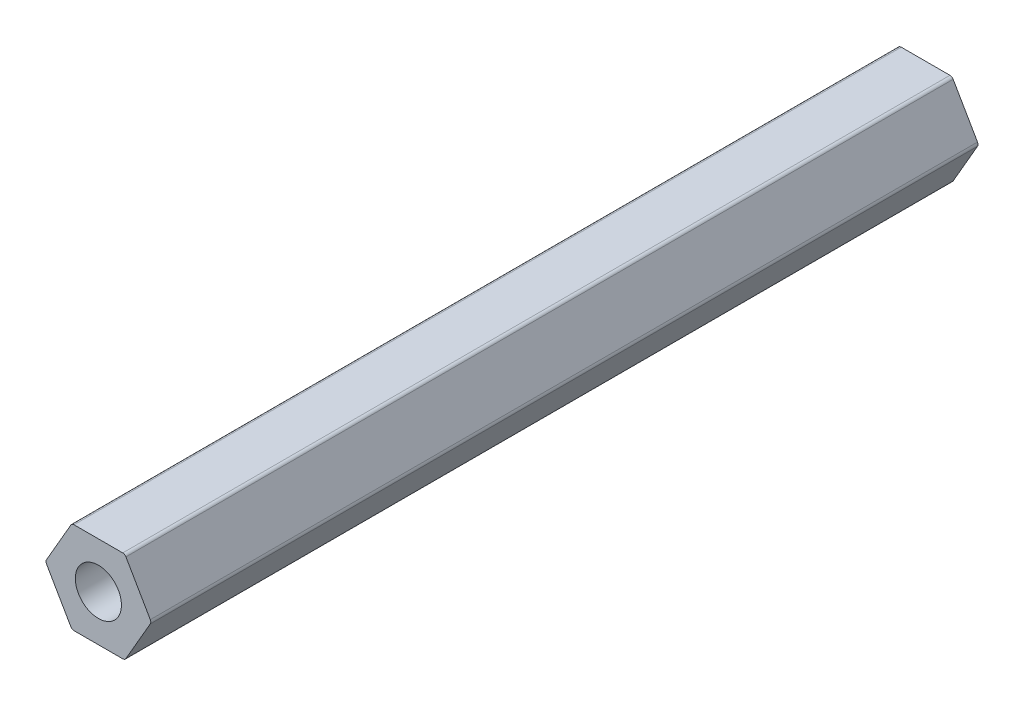
ISO-10303-21;
HEADER;
FILE_DESCRIPTION(('STEP AP214'),'2;1');
FILE_NAME('part.step','',(''),(''),'','','');
FILE_SCHEMA(('AUTOMOTIVE_DESIGN { 1 0 10303 214 1 1 1 1 }'));
ENDSEC;
DATA;
#1=APPLICATION_CONTEXT('core data for automotive mechanical design processes');
#2=APPLICATION_PROTOCOL_DEFINITION('international standard','automotive_design',2000,#1);
#3=PRODUCT_CONTEXT('',#1,'mechanical');
#4=PRODUCT('Part','Part','',(#3));
#5=PRODUCT_RELATED_PRODUCT_CATEGORY('part','',(#4));
#6=PRODUCT_DEFINITION_FORMATION('','',#4);
#7=PRODUCT_DEFINITION_CONTEXT('part definition',#1,'design');
#8=PRODUCT_DEFINITION('design','',#6,#7);
#9=PRODUCT_DEFINITION_SHAPE('','',#8);
#10=(LENGTH_UNIT() NAMED_UNIT(*) SI_UNIT(.MILLI.,.METRE.));
#11=(NAMED_UNIT(*) PLANE_ANGLE_UNIT() SI_UNIT($,.RADIAN.));
#12=(NAMED_UNIT(*) SI_UNIT($,.STERADIAN.) SOLID_ANGLE_UNIT());
#13=UNCERTAINTY_MEASURE_WITH_UNIT(LENGTH_MEASURE(1.E-05),#10,'distance_accuracy_value','');
#14=(GEOMETRIC_REPRESENTATION_CONTEXT(3) GLOBAL_UNCERTAINTY_ASSIGNED_CONTEXT((#13)) GLOBAL_UNIT_ASSIGNED_CONTEXT((#10,
#11,#12)) REPRESENTATION_CONTEXT('',''));
#15=CARTESIAN_POINT('',(0.,0.,0.));
#16=DIRECTION('',(0.,0.,1.));
#17=DIRECTION('',(1.,0.,0.));
#18=AXIS2_PLACEMENT_3D('',#15,#16,#17);
#19=CARTESIAN_POINT('',(-3.36554792418708,-5.8293,228.6));
#20=DIRECTION('',(0.,0.,-1.));
#21=DIRECTION('',(-1.,0.,0.));
#22=AXIS2_PLACEMENT_3D('',#19,#20,#21);
#23=CYLINDRICAL_SURFACE('',#22,0.508);
#24=DIRECTION('',(0.,0.,1.));
#25=VECTOR('',#24,1.);
#26=CARTESIAN_POINT('',(-3.36554792418708,-6.3373,228.6));
#27=LINE('',#26,#25);
#28=CARTESIAN_POINT('',(-3.36554792418708,-6.3373,-228.6));
#29=VERTEX_POINT('',#28);
#30=CARTESIAN_POINT('',(-3.36554792418708,-6.3373,-114.3));
#31=VERTEX_POINT('',#30);
#32=EDGE_CURVE('E150',#29,#31,#27,.T.);
#33=ORIENTED_EDGE('',*,*,#32,.T.);
#34=CARTESIAN_POINT('',(-3.36554792418708,-5.8293,-114.3));
#35=DIRECTION('',(0.,0.,1.));
#36=DIRECTION('',(1.,0.,0.));
#37=AXIS2_PLACEMENT_3D('',#34,#35,#36);
#38=CIRCLE('',#37,0.507999999999999);
#39=CARTESIAN_POINT('',(-3.80548882930957,-6.0833,-114.3));
#40=VERTEX_POINT('',#39);
#41=EDGE_CURVE('E200',#40,#31,#38,.T.);
#42=ORIENTED_EDGE('',*,*,#41,.F.);
#43=DIRECTION('',(0.,0.,1.));
#44=VECTOR('',#43,1.);
#45=CARTESIAN_POINT('',(-3.80548882930957,-6.0833,228.6));
#46=LINE('',#45,#44);
#47=CARTESIAN_POINT('',(-3.80548882930957,-6.0833,-228.6));
#48=VERTEX_POINT('',#47);
#49=EDGE_CURVE('E117',#40,#48,#46,.F.);
#50=ORIENTED_EDGE('',*,*,#49,.T.);
#51=CARTESIAN_POINT('',(-3.36554792418708,-5.8293,-228.6));
#52=DIRECTION('',(0.,0.,-1.));
#53=DIRECTION('',(-1.,0.,0.));
#54=AXIS2_PLACEMENT_3D('',#51,#52,#53);
#55=CIRCLE('',#54,0.508);
#56=EDGE_CURVE('E37',#48,#29,#55,.F.);
#57=ORIENTED_EDGE('',*,*,#56,.T.);
#58=EDGE_LOOP('',(#33,#42,#50,#57));
#59=FACE_BOUND('',#58,.T.);
#60=ADVANCED_FACE('F34',(#59),#23,.T.);
#61=CARTESIAN_POINT('',(3.36554792418708,5.8293,228.6));
#62=DIRECTION('',(0.,0.,-1.));
#63=DIRECTION('',(-1.,0.,0.));
#64=AXIS2_PLACEMENT_3D('',#61,#62,#63);
#65=CYLINDRICAL_SURFACE('',#64,0.508);
#66=DIRECTION('',(0.,0.,1.));
#67=VECTOR('',#66,1.);
#68=CARTESIAN_POINT('',(3.36554792418708,6.3373,228.6));
#69=LINE('',#68,#67);
#70=CARTESIAN_POINT('',(3.36554792418708,6.3373,-228.6));
#71=VERTEX_POINT('',#70);
#72=CARTESIAN_POINT('',(3.36554792418708,6.3373,-114.3));
#73=VERTEX_POINT('',#72);
#74=EDGE_CURVE('E144',#71,#73,#69,.T.);
#75=ORIENTED_EDGE('',*,*,#74,.T.);
#76=CARTESIAN_POINT('',(3.36554792418708,5.8293,-114.3));
#77=DIRECTION('',(0.,0.,1.));
#78=DIRECTION('',(1.,0.,0.));
#79=AXIS2_PLACEMENT_3D('',#76,#77,#78);
#80=CIRCLE('',#79,0.508000000000001);
#81=CARTESIAN_POINT('',(3.80548882930958,6.0833,-114.3));
#82=VERTEX_POINT('',#81);
#83=EDGE_CURVE('E234',#82,#73,#80,.T.);
#84=ORIENTED_EDGE('',*,*,#83,.F.);
#85=DIRECTION('',(0.,0.,1.));
#86=VECTOR('',#85,1.);
#87=CARTESIAN_POINT('',(3.80548882930958,6.0833,228.6));
#88=LINE('',#87,#86);
#89=CARTESIAN_POINT('',(3.80548882930958,6.0833,-228.6));
#90=VERTEX_POINT('',#89);
#91=EDGE_CURVE('E147',#82,#90,#88,.F.);
#92=ORIENTED_EDGE('',*,*,#91,.T.);
#93=CARTESIAN_POINT('',(3.36554792418708,5.8293,-228.6));
#94=DIRECTION('',(0.,0.,-1.));
#95=DIRECTION('',(-1.,0.,0.));
#96=AXIS2_PLACEMENT_3D('',#93,#94,#95);
#97=CIRCLE('',#96,0.508);
#98=EDGE_CURVE('E161',#90,#71,#97,.F.);
#99=ORIENTED_EDGE('',*,*,#98,.T.);
#100=EDGE_LOOP('',(#75,#84,#92,#99));
#101=FACE_BOUND('',#100,.T.);
#102=ADVANCED_FACE('F233',(#101),#65,.T.);
#103=CARTESIAN_POINT('',(-3.36554792418708,5.8293,228.6));
#104=DIRECTION('',(0.,0.,-1.));
#105=DIRECTION('',(-1.,0.,0.));
#106=AXIS2_PLACEMENT_3D('',#103,#104,#105);
#107=CYLINDRICAL_SURFACE('',#106,0.508);
#108=DIRECTION('',(0.,0.,1.));
#109=VECTOR('',#108,1.);
#110=CARTESIAN_POINT('',(-3.80548882930958,6.0833,228.6));
#111=LINE('',#110,#109);
#112=CARTESIAN_POINT('',(-3.80548882930958,6.0833,-228.6));
#113=VERTEX_POINT('',#112);
#114=CARTESIAN_POINT('',(-3.80548882930958,6.0833,-114.3));
#115=VERTEX_POINT('',#114);
#116=EDGE_CURVE('E138',#113,#115,#111,.T.);
#117=ORIENTED_EDGE('',*,*,#116,.T.);
#118=CARTESIAN_POINT('',(-3.36554792418708,5.8293,-114.3));
#119=DIRECTION('',(0.,0.,1.));
#120=DIRECTION('',(1.,0.,0.));
#121=AXIS2_PLACEMENT_3D('',#118,#119,#120);
#122=CIRCLE('',#121,0.508);
#123=CARTESIAN_POINT('',(-3.36554792418708,6.3373,-114.3));
#124=VERTEX_POINT('',#123);
#125=EDGE_CURVE('E169',#124,#115,#122,.T.);
#126=ORIENTED_EDGE('',*,*,#125,.F.);
#127=DIRECTION('',(0.,0.,1.));
#128=VECTOR('',#127,1.);
#129=CARTESIAN_POINT('',(-3.36554792418708,6.3373,228.6));
#130=LINE('',#129,#128);
#131=CARTESIAN_POINT('',(-3.36554792418708,6.3373,-228.6));
#132=VERTEX_POINT('',#131);
#133=EDGE_CURVE('E141',#124,#132,#130,.F.);
#134=ORIENTED_EDGE('',*,*,#133,.T.);
#135=CARTESIAN_POINT('',(-3.36554792418708,5.8293,-228.6));
#136=DIRECTION('',(0.,0.,-1.));
#137=DIRECTION('',(-1.,0.,0.));
#138=AXIS2_PLACEMENT_3D('',#135,#136,#137);
#139=CIRCLE('',#138,0.508);
#140=EDGE_CURVE('E107',#132,#113,#139,.F.);
#141=ORIENTED_EDGE('',*,*,#140,.T.);
#142=EDGE_LOOP('',(#117,#126,#134,#141));
#143=FACE_BOUND('',#142,.T.);
#144=ADVANCED_FACE('F227',(#143),#107,.T.);
#145=CARTESIAN_POINT('',(-6.73109584837417,0.,228.6));
#146=DIRECTION('',(0.,0.,-1.));
#147=DIRECTION('',(-1.,0.,0.));
#148=AXIS2_PLACEMENT_3D('',#145,#146,#147);
#149=CYLINDRICAL_SURFACE('',#148,0.508);
#150=DIRECTION('',(0.,0.,1.));
#151=VECTOR('',#150,1.);
#152=CARTESIAN_POINT('',(-7.17103675349666,-0.254000000000004,228.6));
#153=LINE('',#152,#151);
#154=CARTESIAN_POINT('',(-7.17103675349666,-0.254000000000004,-228.6));
#155=VERTEX_POINT('',#154);
#156=CARTESIAN_POINT('',(-7.17103675349666,-0.254000000000005,-114.3));
#157=VERTEX_POINT('',#156);
#158=EDGE_CURVE('E100',#155,#157,#153,.T.);
#159=ORIENTED_EDGE('',*,*,#158,.T.);
#160=CARTESIAN_POINT('',(-6.73109584837417,0.,-114.3));
#161=DIRECTION('',(0.,0.,1.));
#162=DIRECTION('',(1.,0.,0.));
#163=AXIS2_PLACEMENT_3D('',#160,#161,#162);
#164=CIRCLE('',#163,0.508000000000001);
#165=CARTESIAN_POINT('',(-7.17103675349666,0.253999999999996,-114.3));
#166=VERTEX_POINT('',#165);
#167=EDGE_CURVE('E252',#166,#157,#164,.T.);
#168=ORIENTED_EDGE('',*,*,#167,.F.);
#169=DIRECTION('',(0.,0.,1.));
#170=VECTOR('',#169,1.);
#171=CARTESIAN_POINT('',(-7.17103675349666,0.253999999999996,228.6));
#172=LINE('',#171,#170);
#173=CARTESIAN_POINT('',(-7.17103675349666,0.253999999999996,-228.6));
#174=VERTEX_POINT('',#173);
#175=EDGE_CURVE('E102',#166,#174,#172,.F.);
#176=ORIENTED_EDGE('',*,*,#175,.T.);
#177=CARTESIAN_POINT('',(-6.73109584837417,0.,-228.6));
#178=DIRECTION('',(0.,0.,-1.));
#179=DIRECTION('',(-1.,0.,0.));
#180=AXIS2_PLACEMENT_3D('',#177,#178,#179);
#181=CIRCLE('',#180,0.508);
#182=EDGE_CURVE('E95',#174,#155,#181,.F.);
#183=ORIENTED_EDGE('',*,*,#182,.T.);
#184=EDGE_LOOP('',(#159,#168,#176,#183));
#185=FACE_BOUND('',#184,.T.);
#186=ADVANCED_FACE('F97',(#185),#149,.T.);
#187=CARTESIAN_POINT('',(-7.31768372187083,0.,228.6));
#188=DIRECTION('',(0.866025403784438,0.5,0.));
#189=DIRECTION('',(-0.5,0.866025403784438,0.));
#190=AXIS2_PLACEMENT_3D('',#187,#188,#189);
#191=PLANE('',#190);
#192=DIRECTION('',(0.500000000000001,-0.866025403784438,0.));
#193=VECTOR('',#192,1.);
#194=CARTESIAN_POINT('',(-7.17103675349666,-0.254000000000005,-114.3));
#195=LINE('',#194,#193);
#196=EDGE_CURVE('E116',#157,#40,#195,.T.);
#197=ORIENTED_EDGE('',*,*,#196,.F.);
#198=ORIENTED_EDGE('',*,*,#158,.F.);
#199=DIRECTION('',(0.500000000000001,-0.866025403784438,0.));
#200=VECTOR('',#199,1.);
#201=CARTESIAN_POINT('',(-7.17103675349666,-0.254000000000004,-228.6));
#202=LINE('',#201,#200);
#203=EDGE_CURVE('E114',#155,#48,#202,.T.);
#204=ORIENTED_EDGE('',*,*,#203,.T.);
#205=ORIENTED_EDGE('',*,*,#49,.F.);
#206=EDGE_LOOP('',(#197,#198,#204,#205));
#207=FACE_BOUND('',#206,.T.);
#208=ADVANCED_FACE('F112',(#207),#191,.F.);
#209=CARTESIAN_POINT('',(-3.65884186093541,-6.3373,228.6));
#210=DIRECTION('',(0.,1.,0.));
#211=DIRECTION('',(-1.,0.,0.));
#212=AXIS2_PLACEMENT_3D('',#209,#210,#211);
#213=PLANE('',#212);
#214=DIRECTION('',(1.,0.,0.));
#215=VECTOR('',#214,1.);
#216=CARTESIAN_POINT('',(-3.36554792418708,-6.3373,-114.3));
#217=LINE('',#216,#215);
#218=CARTESIAN_POINT('',(3.36554792418708,-6.3373,-114.3));
#219=VERTEX_POINT('',#218);
#220=EDGE_CURVE('E192',#31,#219,#217,.T.);
#221=ORIENTED_EDGE('',*,*,#220,.F.);
#222=ORIENTED_EDGE('',*,*,#32,.F.);
#223=DIRECTION('',(1.,0.,0.));
#224=VECTOR('',#223,1.);
#225=CARTESIAN_POINT('',(7.31768372187083,-6.3373,-228.6));
#226=LINE('',#225,#224);
#227=CARTESIAN_POINT('',(3.36554792418708,-6.3373,-228.6));
#228=VERTEX_POINT('',#227);
#229=EDGE_CURVE('E122',#29,#228,#226,.T.);
#230=ORIENTED_EDGE('',*,*,#229,.T.);
#231=DIRECTION('',(0.,0.,-1.));
#232=VECTOR('',#231,1.);
#233=CARTESIAN_POINT('',(3.36554792418708,-6.3373,228.6));
#234=LINE('',#233,#232);
#235=EDGE_CURVE('E126',#219,#228,#234,.T.);
#236=ORIENTED_EDGE('',*,*,#235,.F.);
#237=EDGE_LOOP('',(#221,#222,#230,#236));
#238=FACE_BOUND('',#237,.T.);
#239=ADVANCED_FACE('F196',(#238),#213,.F.);
#240=CARTESIAN_POINT('',(7.31768372187083,0.,228.6));
#241=DIRECTION('',(-0.866025403784439,-0.5,0.));
#242=DIRECTION('',(0.5,-0.866025403784439,0.));
#243=AXIS2_PLACEMENT_3D('',#240,#241,#242);
#244=PLANE('',#243);
#245=DIRECTION('',(-0.5,0.866025403784439,0.));
#246=VECTOR('',#245,1.);
#247=CARTESIAN_POINT('',(7.17103675349666,0.254000000000003,-114.3));
#248=LINE('',#247,#246);
#249=CARTESIAN_POINT('',(7.17103675349666,0.254000000000003,-114.3));
#250=VERTEX_POINT('',#249);
#251=EDGE_CURVE('E236',#250,#82,#248,.T.);
#252=ORIENTED_EDGE('',*,*,#251,.F.);
#253=DIRECTION('',(0.,0.,-1.));
#254=VECTOR('',#253,1.);
#255=CARTESIAN_POINT('',(7.17103675349666,0.254000000000004,228.6));
#256=LINE('',#255,#254);
#257=CARTESIAN_POINT('',(7.17103675349666,0.254000000000003,-228.6));
#258=VERTEX_POINT('',#257);
#259=EDGE_CURVE('E143',#258,#250,#256,.F.);
#260=ORIENTED_EDGE('',*,*,#259,.F.);
#261=DIRECTION('',(-0.5,0.866025403784438,0.));
#262=VECTOR('',#261,1.);
#263=CARTESIAN_POINT('',(7.17103675349666,0.254000000000003,-228.6));
#264=LINE('',#263,#262);
#265=EDGE_CURVE('E134',#258,#90,#264,.T.);
#266=ORIENTED_EDGE('',*,*,#265,.T.);
#267=ORIENTED_EDGE('',*,*,#91,.F.);
#268=EDGE_LOOP('',(#252,#260,#266,#267));
#269=FACE_BOUND('',#268,.T.);
#270=ADVANCED_FACE('F240',(#269),#244,.F.);
#271=CARTESIAN_POINT('',(3.65884186093541,6.3373,228.6));
#272=DIRECTION('',(0.,-1.,0.));
#273=DIRECTION('',(1.,0.,0.));
#274=AXIS2_PLACEMENT_3D('',#271,#272,#273);
#275=PLANE('',#274);
#276=DIRECTION('',(-1.,0.,0.));
#277=VECTOR('',#276,1.);
#278=CARTESIAN_POINT('',(3.36554792418708,6.3373,-114.3));
#279=LINE('',#278,#277);
#280=EDGE_CURVE('E174',#73,#124,#279,.T.);
#281=ORIENTED_EDGE('',*,*,#280,.F.);
#282=ORIENTED_EDGE('',*,*,#74,.F.);
#283=DIRECTION('',(1.,0.,0.));
#284=VECTOR('',#283,1.);
#285=CARTESIAN_POINT('',(7.31768372187083,6.3373,-228.6));
#286=LINE('',#285,#284);
#287=EDGE_CURVE('E128',#71,#132,#286,.F.);
#288=ORIENTED_EDGE('',*,*,#287,.T.);
#289=ORIENTED_EDGE('',*,*,#133,.F.);
#290=EDGE_LOOP('',(#281,#282,#288,#289));
#291=FACE_BOUND('',#290,.T.);
#292=ADVANCED_FACE('F231',(#291),#275,.F.);
#293=CARTESIAN_POINT('',(-3.65884186093541,6.3373,228.6));
#294=DIRECTION('',(0.866025403784439,-0.5,0.));
#295=DIRECTION('',(0.5,0.866025403784439,0.));
#296=AXIS2_PLACEMENT_3D('',#293,#294,#295);
#297=PLANE('',#296);
#298=DIRECTION('',(-0.5,-0.866025403784439,0.));
#299=VECTOR('',#298,1.);
#300=CARTESIAN_POINT('',(-3.80548882930958,6.0833,-114.3));
#301=LINE('',#300,#299);
#302=EDGE_CURVE('E165',#115,#166,#301,.T.);
#303=ORIENTED_EDGE('',*,*,#302,.F.);
#304=ORIENTED_EDGE('',*,*,#116,.F.);
#305=DIRECTION('',(-0.5,-0.866025403784439,0.));
#306=VECTOR('',#305,1.);
#307=CARTESIAN_POINT('',(-3.80548882930958,6.0833,-228.6));
#308=LINE('',#307,#306);
#309=EDGE_CURVE('E123',#113,#174,#308,.T.);
#310=ORIENTED_EDGE('',*,*,#309,.T.);
#311=ORIENTED_EDGE('',*,*,#175,.F.);
#312=EDGE_LOOP('',(#303,#304,#310,#311));
#313=FACE_BOUND('',#312,.T.);
#314=ADVANCED_FACE('F226',(#313),#297,.F.);
#315=CARTESIAN_POINT('',(6.73109584837417,0.,228.6));
#316=DIRECTION('',(0.,0.,-1.));
#317=DIRECTION('',(-1.,0.,0.));
#318=AXIS2_PLACEMENT_3D('',#315,#316,#317);
#319=CYLINDRICAL_SURFACE('',#318,0.508);
#320=ORIENTED_EDGE('',*,*,#259,.T.);
#321=CARTESIAN_POINT('',(6.73109584837417,0.,-114.3));
#322=DIRECTION('',(0.,0.,1.));
#323=DIRECTION('',(1.,0.,0.));
#324=AXIS2_PLACEMENT_3D('',#321,#322,#323);
#325=CIRCLE('',#324,0.508);
#326=CARTESIAN_POINT('',(7.17103675349667,-0.253999999999996,-114.3));
#327=VERTEX_POINT('',#326);
#328=EDGE_CURVE('E244',#327,#250,#325,.T.);
#329=ORIENTED_EDGE('',*,*,#328,.F.);
#330=DIRECTION('',(0.,0.,1.));
#331=VECTOR('',#330,1.);
#332=CARTESIAN_POINT('',(7.17103675349666,-0.253999999999996,228.6));
#333=LINE('',#332,#331);
#334=CARTESIAN_POINT('',(7.17103675349666,-0.253999999999997,-228.6));
#335=VERTEX_POINT('',#334);
#336=EDGE_CURVE('E158',#327,#335,#333,.F.);
#337=ORIENTED_EDGE('',*,*,#336,.T.);
#338=CARTESIAN_POINT('',(6.73109584837417,0.,-228.6));
#339=DIRECTION('',(0.,0.,-1.));
#340=DIRECTION('',(-1.,0.,0.));
#341=AXIS2_PLACEMENT_3D('',#338,#339,#340);
#342=CIRCLE('',#341,0.508);
#343=EDGE_CURVE('E137',#335,#258,#342,.F.);
#344=ORIENTED_EDGE('',*,*,#343,.T.);
#345=EDGE_LOOP('',(#320,#329,#337,#344));
#346=FACE_BOUND('',#345,.T.);
#347=ADVANCED_FACE('F242',(#346),#319,.T.);
#348=CARTESIAN_POINT('',(3.36554792418709,-5.8293,228.6));
#349=DIRECTION('',(0.,0.,-1.));
#350=DIRECTION('',(-1.,0.,0.));
#351=AXIS2_PLACEMENT_3D('',#348,#349,#350);
#352=CYLINDRICAL_SURFACE('',#351,0.508);
#353=DIRECTION('',(0.,0.,1.));
#354=VECTOR('',#353,1.);
#355=CARTESIAN_POINT('',(3.80548882930958,-6.0833,228.6));
#356=LINE('',#355,#354);
#357=CARTESIAN_POINT('',(3.80548882930958,-6.0833,-228.6));
#358=VERTEX_POINT('',#357);
#359=CARTESIAN_POINT('',(3.80548882930958,-6.0833,-114.3));
#360=VERTEX_POINT('',#359);
#361=EDGE_CURVE('E11',#358,#360,#356,.T.);
#362=ORIENTED_EDGE('',*,*,#361,.T.);
#363=CARTESIAN_POINT('',(3.36554792418709,-5.8293,-114.3));
#364=DIRECTION('',(0.,0.,1.));
#365=DIRECTION('',(1.,0.,0.));
#366=AXIS2_PLACEMENT_3D('',#363,#364,#365);
#367=CIRCLE('',#366,0.508000000000001);
#368=EDGE_CURVE('E50',#219,#360,#367,.T.);
#369=ORIENTED_EDGE('',*,*,#368,.F.);
#370=ORIENTED_EDGE('',*,*,#235,.T.);
#371=CARTESIAN_POINT('',(3.36554792418709,-5.8293,-228.6));
#372=DIRECTION('',(0.,0.,-1.));
#373=DIRECTION('',(-1.,0.,0.));
#374=AXIS2_PLACEMENT_3D('',#371,#372,#373);
#375=CIRCLE('',#374,0.508);
#376=EDGE_CURVE('E58',#228,#358,#375,.F.);
#377=ORIENTED_EDGE('',*,*,#376,.T.);
#378=EDGE_LOOP('',(#362,#369,#370,#377));
#379=FACE_BOUND('',#378,.T.);
#380=ADVANCED_FACE('F187',(#379),#352,.T.);
#381=CARTESIAN_POINT('',(3.65884186093542,-6.3373,228.6));
#382=DIRECTION('',(-0.866025403784439,0.5,0.));
#383=DIRECTION('',(-0.5,-0.866025403784439,0.));
#384=AXIS2_PLACEMENT_3D('',#381,#382,#383);
#385=PLANE('',#384);
#386=DIRECTION('',(0.499999999999999,0.866025403784439,0.));
#387=VECTOR('',#386,1.);
#388=CARTESIAN_POINT('',(3.80548882930958,-6.0833,-114.3));
#389=LINE('',#388,#387);
#390=EDGE_CURVE('E186',#360,#327,#389,.T.);
#391=ORIENTED_EDGE('',*,*,#390,.F.);
#392=ORIENTED_EDGE('',*,*,#361,.F.);
#393=DIRECTION('',(-0.5,-0.866025403784439,0.));
#394=VECTOR('',#393,1.);
#395=CARTESIAN_POINT('',(3.65884186093542,-6.3373,-228.6));
#396=LINE('',#395,#394);
#397=EDGE_CURVE('E42',#335,#358,#396,.T.);
#398=ORIENTED_EDGE('',*,*,#397,.F.);
#399=ORIENTED_EDGE('',*,*,#336,.F.);
#400=EDGE_LOOP('',(#391,#392,#398,#399));
#401=FACE_BOUND('',#400,.T.);
#402=ADVANCED_FACE('F184',(#401),#385,.F.);
#403=CARTESIAN_POINT('',(7.31768372187083,0.,-228.6));
#404=DIRECTION('',(0.,0.,1.));
#405=DIRECTION('',(1.,0.,0.));
#406=AXIS2_PLACEMENT_3D('',#403,#404,#405);
#407=PLANE('',#406);
#408=CARTESIAN_POINT('',(0.,0.,-228.6));
#409=DIRECTION('',(0.,0.,-1.));
#410=DIRECTION('',(-1.,0.,0.));
#411=AXIS2_PLACEMENT_3D('',#408,#409,#410);
#412=CIRCLE('',#411,3.1877);
#413=CARTESIAN_POINT('',(-3.1877,0.,-228.6));
#414=VERTEX_POINT('',#413);
#415=EDGE_CURVE('E255',#414,#414,#412,.T.);
#416=ORIENTED_EDGE('',*,*,#415,.F.);
#417=EDGE_LOOP('',(#416));
#418=FACE_BOUND('',#417,.T.);
#419=ORIENTED_EDGE('',*,*,#56,.F.);
#420=ORIENTED_EDGE('',*,*,#203,.F.);
#421=ORIENTED_EDGE('',*,*,#182,.F.);
#422=ORIENTED_EDGE('',*,*,#309,.F.);
#423=ORIENTED_EDGE('',*,*,#140,.F.);
#424=ORIENTED_EDGE('',*,*,#287,.F.);
#425=ORIENTED_EDGE('',*,*,#98,.F.);
#426=ORIENTED_EDGE('',*,*,#265,.F.);
#427=ORIENTED_EDGE('',*,*,#343,.F.);
#428=ORIENTED_EDGE('',*,*,#397,.T.);
#429=ORIENTED_EDGE('',*,*,#376,.F.);
#430=ORIENTED_EDGE('',*,*,#229,.F.);
#431=EDGE_LOOP('',(#419,#420,#421,#422,#423,#424,#425,#426,#427,#428,#429,#430));
#432=FACE_BOUND('',#431,.T.);
#433=ADVANCED_FACE('F120',(#418,#432),#407,.F.);
#434=CARTESIAN_POINT('',(-6.73109584837417,0.,-114.3));
#435=DIRECTION('',(0.,0.,1.));
#436=DIRECTION('',(1.,0.,0.));
#437=AXIS2_PLACEMENT_3D('',#434,#435,#436);
#438=PLANE('',#437);
#439=CARTESIAN_POINT('',(0.,0.,-114.3));
#440=DIRECTION('',(0.,0.,-1.));
#441=DIRECTION('',(-1.,0.,0.));
#442=AXIS2_PLACEMENT_3D('',#439,#440,#441);
#443=CIRCLE('',#442,3.1877);
#444=CARTESIAN_POINT('',(-3.1877,0.,-114.3));
#445=VERTEX_POINT('',#444);
#446=EDGE_CURVE('E254',#445,#445,#443,.T.);
#447=ORIENTED_EDGE('',*,*,#446,.T.);
#448=EDGE_LOOP('',(#447));
#449=FACE_BOUND('',#448,.T.);
#450=ORIENTED_EDGE('',*,*,#167,.T.);
#451=ORIENTED_EDGE('',*,*,#196,.T.);
#452=ORIENTED_EDGE('',*,*,#41,.T.);
#453=ORIENTED_EDGE('',*,*,#220,.T.);
#454=ORIENTED_EDGE('',*,*,#368,.T.);
#455=ORIENTED_EDGE('',*,*,#390,.T.);
#456=ORIENTED_EDGE('',*,*,#328,.T.);
#457=ORIENTED_EDGE('',*,*,#251,.T.);
#458=ORIENTED_EDGE('',*,*,#83,.T.);
#459=ORIENTED_EDGE('',*,*,#280,.T.);
#460=ORIENTED_EDGE('',*,*,#125,.T.);
#461=ORIENTED_EDGE('',*,*,#302,.T.);
#462=EDGE_LOOP('',(#450,#451,#452,#453,#454,#455,#456,#457,#458,#459,#460,#461));
#463=FACE_BOUND('',#462,.T.);
#464=ADVANCED_FACE('F220',(#449,#463),#438,.T.);
#465=CARTESIAN_POINT('',(0.,0.,-114.3));
#466=DIRECTION('',(0.,0.,-1.));
#467=DIRECTION('',(-1.,0.,0.));
#468=AXIS2_PLACEMENT_3D('',#465,#466,#467);
#469=CYLINDRICAL_SURFACE('',#468,3.1877);
#470=CARTESIAN_POINT('',(-3.1877,0.,-114.3));
#471=CARTESIAN_POINT('',(-3.1877,0.,-115.490625));
#472=CARTESIAN_POINT('',(-3.1877,0.,-116.68125));
#473=CARTESIAN_POINT('',(-3.1877,0.,-119.0625));
#474=CARTESIAN_POINT('',(-3.1877,0.,-120.253125));
#475=CARTESIAN_POINT('',(-3.1877,0.,-122.634375));
#476=CARTESIAN_POINT('',(-3.1877,0.,-123.825));
#477=CARTESIAN_POINT('',(-3.1877,0.,-126.20625));
#478=CARTESIAN_POINT('',(-3.1877,0.,-127.396875));
#479=CARTESIAN_POINT('',(-3.1877,0.,-129.778125));
#480=CARTESIAN_POINT('',(-3.1877,0.,-130.96875));
#481=CARTESIAN_POINT('',(-3.1877,0.,-133.35));
#482=CARTESIAN_POINT('',(-3.1877,0.,-134.540625));
#483=CARTESIAN_POINT('',(-3.1877,0.,-136.921875));
#484=CARTESIAN_POINT('',(-3.1877,0.,-138.1125));
#485=CARTESIAN_POINT('',(-3.1877,0.,-140.49375));
#486=CARTESIAN_POINT('',(-3.1877,0.,-141.684375));
#487=CARTESIAN_POINT('',(-3.1877,0.,-144.065625));
#488=CARTESIAN_POINT('',(-3.1877,0.,-145.25625));
#489=CARTESIAN_POINT('',(-3.1877,0.,-147.6375));
#490=CARTESIAN_POINT('',(-3.1877,0.,-148.828125));
#491=CARTESIAN_POINT('',(-3.1877,0.,-151.209375));
#492=CARTESIAN_POINT('',(-3.1877,0.,-152.4));
#493=CARTESIAN_POINT('',(-3.1877,0.,-154.78125));
#494=CARTESIAN_POINT('',(-3.1877,0.,-155.971875));
#495=CARTESIAN_POINT('',(-3.1877,0.,-158.353125));
#496=CARTESIAN_POINT('',(-3.1877,0.,-159.54375));
#497=CARTESIAN_POINT('',(-3.1877,0.,-161.925));
#498=CARTESIAN_POINT('',(-3.1877,0.,-163.115625));
#499=CARTESIAN_POINT('',(-3.1877,0.,-165.496875));
#500=CARTESIAN_POINT('',(-3.1877,0.,-166.6875));
#501=CARTESIAN_POINT('',(-3.1877,0.,-169.06875));
#502=CARTESIAN_POINT('',(-3.1877,0.,-170.259375));
#503=CARTESIAN_POINT('',(-3.1877,0.,-172.640625));
#504=CARTESIAN_POINT('',(-3.1877,0.,-173.83125));
#505=CARTESIAN_POINT('',(-3.1877,0.,-176.2125));
#506=CARTESIAN_POINT('',(-3.1877,0.,-177.403125));
#507=CARTESIAN_POINT('',(-3.1877,0.,-179.784375));
#508=CARTESIAN_POINT('',(-3.1877,0.,-180.975));
#509=CARTESIAN_POINT('',(-3.1877,0.,-183.35625));
#510=CARTESIAN_POINT('',(-3.1877,0.,-184.546875));
#511=CARTESIAN_POINT('',(-3.1877,0.,-186.928125));
#512=CARTESIAN_POINT('',(-3.1877,0.,-188.11875));
#513=CARTESIAN_POINT('',(-3.1877,0.,-190.5));
#514=CARTESIAN_POINT('',(-3.1877,0.,-191.690625));
#515=CARTESIAN_POINT('',(-3.1877,0.,-194.071875));
#516=CARTESIAN_POINT('',(-3.1877,0.,-195.2625));
#517=CARTESIAN_POINT('',(-3.1877,0.,-197.64375));
#518=CARTESIAN_POINT('',(-3.1877,0.,-198.834375));
#519=CARTESIAN_POINT('',(-3.1877,0.,-201.215625));
#520=CARTESIAN_POINT('',(-3.1877,0.,-202.40625));
#521=CARTESIAN_POINT('',(-3.1877,0.,-204.7875));
#522=CARTESIAN_POINT('',(-3.1877,0.,-205.978125));
#523=CARTESIAN_POINT('',(-3.1877,0.,-208.359375));
#524=CARTESIAN_POINT('',(-3.1877,0.,-209.55));
#525=CARTESIAN_POINT('',(-3.1877,0.,-211.93125));
#526=CARTESIAN_POINT('',(-3.1877,0.,-213.121875));
#527=CARTESIAN_POINT('',(-3.1877,0.,-215.503125));
#528=CARTESIAN_POINT('',(-3.1877,0.,-216.69375));
#529=CARTESIAN_POINT('',(-3.1877,0.,-219.075));
#530=CARTESIAN_POINT('',(-3.1877,0.,-220.265625));
#531=CARTESIAN_POINT('',(-3.1877,0.,-222.646875));
#532=CARTESIAN_POINT('',(-3.1877,0.,-223.8375));
#533=CARTESIAN_POINT('',(-3.1877,0.,-226.21875));
#534=CARTESIAN_POINT('',(-3.1877,0.,-227.409375));
#535=CARTESIAN_POINT('',(-3.1877,0.,-228.6));
#536=B_SPLINE_CURVE_WITH_KNOTS('',3,(#470,#471,#472,#473,#474,#475,#476,#477,#478,#479,#480,
#481,#482,#483,#484,#485,#486,#487,#488,#489,#490,#491,#492,#493,#494,#495,#496,#497,#498,#499,
#500,#501,#502,#503,#504,#505,#506,#507,#508,#509,#510,#511,#512,#513,#514,#515,#516,#517,#518,
#519,#520,#521,#522,#523,#524,#525,#526,#527,#528,#529,#530,#531,#532,#533,#534,#535),
.UNSPECIFIED.,.F.,.F.,(4,2,2,2,2,2,2,2,2,2,2,2,2,2,2,2,2,2,2,2,2,2,2,2,2,2,2,2,2,2,2,2,4),(0.,
3.57187499999999,7.14374999999999,10.715625,14.2875,17.859375,21.43125,25.003125,28.575,
32.146875,35.71875,39.290625,42.8625,46.434375,50.00625,53.578125,57.15,60.721875,64.29375,
67.865625,71.4375,75.009375,78.58125,82.153125,85.725,89.296875,92.86875,96.440625,100.0125,
103.584375,107.15625,110.728125,114.3),.UNSPECIFIED.);
#537=EDGE_CURVE('BSEAM262',#445,#414,#536,.T.);
#538=ORIENTED_EDGE('',*,*,#446,.F.);
#539=ORIENTED_EDGE('',*,*,#415,.T.);
#540=ORIENTED_EDGE('',*,*,#537,.T.);
#541=ORIENTED_EDGE('',*,*,#537,.F.);
#542=EDGE_LOOP('',(#538,#540,#539,#541));
#543=FACE_BOUND('',#542,.T.);
#544=ADVANCED_FACE('F262',(#543),#469,.F.);
#545=CLOSED_SHELL('',(#60,#102,#144,#186,#208,#239,#270,#292,#314,#347,#380,#402,#433,#464,#544));
#546=MANIFOLD_SOLID_BREP('B2',#545);
#547=ADVANCED_BREP_SHAPE_REPRESENTATION('',(#18,#546),#14);
#548=SHAPE_DEFINITION_REPRESENTATION(#9,#547);
ENDSEC;
END-ISO-10303-21;
